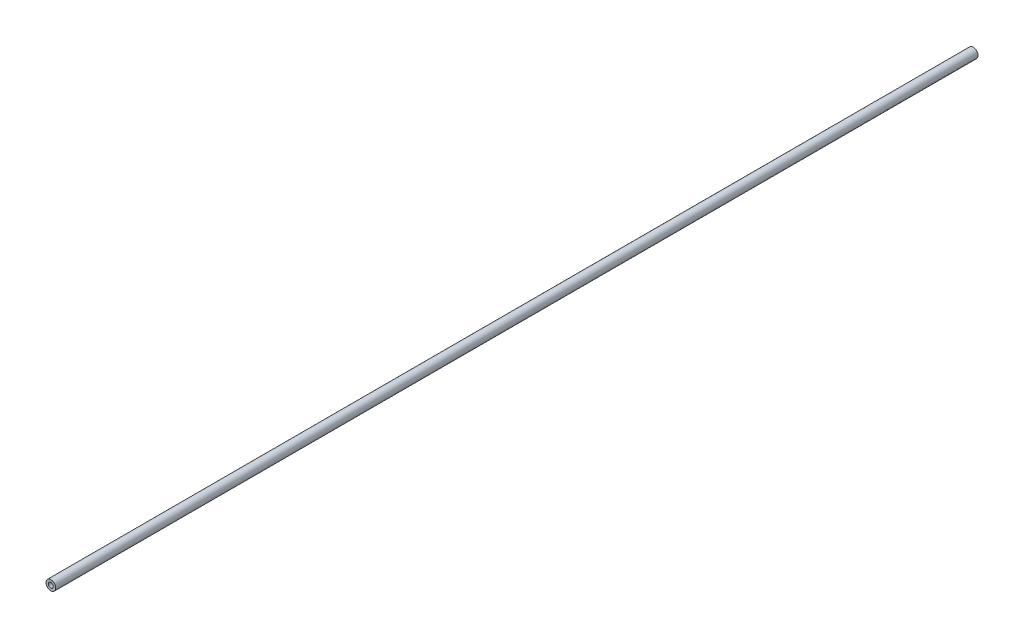
ISO-10303-21;
HEADER;
FILE_DESCRIPTION(('STEP AP214'),'2;1');
FILE_NAME('part.step','',(''),(''),'','','');
FILE_SCHEMA(('AUTOMOTIVE_DESIGN { 1 0 10303 214 1 1 1 1 }'));
ENDSEC;
DATA;
#1=APPLICATION_CONTEXT('core data for automotive mechanical design processes');
#2=APPLICATION_PROTOCOL_DEFINITION('international standard','automotive_design',2000,#1);
#3=PRODUCT_CONTEXT('',#1,'mechanical');
#4=PRODUCT('Part','Part','',(#3));
#5=PRODUCT_RELATED_PRODUCT_CATEGORY('part','',(#4));
#6=PRODUCT_DEFINITION_FORMATION('','',#4);
#7=PRODUCT_DEFINITION_CONTEXT('part definition',#1,'design');
#8=PRODUCT_DEFINITION('design','',#6,#7);
#9=PRODUCT_DEFINITION_SHAPE('','',#8);
#10=(LENGTH_UNIT() NAMED_UNIT(*) SI_UNIT(.MILLI.,.METRE.));
#11=(NAMED_UNIT(*) PLANE_ANGLE_UNIT() SI_UNIT($,.RADIAN.));
#12=(NAMED_UNIT(*) SI_UNIT($,.STERADIAN.) SOLID_ANGLE_UNIT());
#13=UNCERTAINTY_MEASURE_WITH_UNIT(LENGTH_MEASURE(1.E-05),#10,'distance_accuracy_value','');
#14=(GEOMETRIC_REPRESENTATION_CONTEXT(3) GLOBAL_UNCERTAINTY_ASSIGNED_CONTEXT((#13)) GLOBAL_UNIT_ASSIGNED_CONTEXT((#10,
#11,#12)) REPRESENTATION_CONTEXT('',''));
#15=CARTESIAN_POINT('',(0.,0.,0.));
#16=DIRECTION('',(0.,0.,1.));
#17=DIRECTION('',(1.,0.,0.));
#18=AXIS2_PLACEMENT_3D('',#15,#16,#17);
#19=CARTESIAN_POINT('',(0.,0.,380.));
#20=DIRECTION('',(0.,0.,1.));
#21=DIRECTION('',(1.,0.,0.));
#22=AXIS2_PLACEMENT_3D('',#19,#20,#21);
#23=PLANE('',#22);
#24=CARTESIAN_POINT('',(0.,0.,380.));
#25=DIRECTION('',(0.,0.,1.));
#26=DIRECTION('',(1.,0.,0.));
#27=AXIS2_PLACEMENT_3D('',#24,#25,#26);
#28=CIRCLE('',#27,2.);
#29=CARTESIAN_POINT('',(2.,0.,380.));
#30=VERTEX_POINT('',#29);
#31=EDGE_CURVE('E10',#30,#30,#28,.T.);
#32=ORIENTED_EDGE('',*,*,#31,.T.);
#33=EDGE_LOOP('',(#32));
#34=FACE_BOUND('',#33,.T.);
#35=CARTESIAN_POINT('',(0.,0.,380.));
#36=DIRECTION('',(0.,0.,1.));
#37=DIRECTION('',(1.,0.,0.));
#38=AXIS2_PLACEMENT_3D('',#35,#36,#37);
#39=CIRCLE('',#38,1.);
#40=CARTESIAN_POINT('',(1.,0.,380.));
#41=VERTEX_POINT('',#40);
#42=EDGE_CURVE('E43',#41,#41,#39,.T.);
#43=ORIENTED_EDGE('',*,*,#42,.F.);
#44=EDGE_LOOP('',(#43));
#45=FACE_BOUND('',#44,.T.);
#46=ADVANCED_FACE('F32',(#34,#45),#23,.T.);
#47=CARTESIAN_POINT('',(0.,0.,0.));
#48=DIRECTION('',(0.,0.,1.));
#49=DIRECTION('',(1.,0.,0.));
#50=AXIS2_PLACEMENT_3D('',#47,#48,#49);
#51=PLANE('',#50);
#52=CARTESIAN_POINT('',(0.,0.,0.));
#53=DIRECTION('',(0.,0.,1.));
#54=DIRECTION('',(1.,0.,0.));
#55=AXIS2_PLACEMENT_3D('',#52,#53,#54);
#56=CIRCLE('',#55,2.);
#57=CARTESIAN_POINT('',(2.,0.,0.));
#58=VERTEX_POINT('',#57);
#59=EDGE_CURVE('E36',#58,#58,#56,.T.);
#60=ORIENTED_EDGE('',*,*,#59,.F.);
#61=EDGE_LOOP('',(#60));
#62=FACE_BOUND('',#61,.T.);
#63=CARTESIAN_POINT('',(0.,0.,0.));
#64=DIRECTION('',(0.,0.,1.));
#65=DIRECTION('',(1.,0.,0.));
#66=AXIS2_PLACEMENT_3D('',#63,#64,#65);
#67=CIRCLE('',#66,1.);
#68=CARTESIAN_POINT('',(1.,0.,0.));
#69=VERTEX_POINT('',#68);
#70=EDGE_CURVE('E45',#69,#69,#67,.T.);
#71=ORIENTED_EDGE('',*,*,#70,.T.);
#72=EDGE_LOOP('',(#71));
#73=FACE_BOUND('',#72,.T.);
#74=ADVANCED_FACE('F55',(#62,#73),#51,.F.);
#75=CARTESIAN_POINT('',(0.,0.,380.));
#76=DIRECTION('',(0.,0.,-1.));
#77=DIRECTION('',(-1.,0.,0.));
#78=AXIS2_PLACEMENT_3D('',#75,#76,#77);
#79=CYLINDRICAL_SURFACE('',#78,2.);
#80=ORIENTED_EDGE('',*,*,#31,.F.);
#81=EDGE_LOOP('',(#80));
#82=FACE_BOUND('',#81,.T.);
#83=ORIENTED_EDGE('',*,*,#59,.T.);
#84=EDGE_LOOP('',(#83));
#85=FACE_BOUND('',#84,.T.);
#86=ADVANCED_FACE('F34',(#82,#85),#79,.T.);
#87=CARTESIAN_POINT('',(0.,0.,380.));
#88=DIRECTION('',(0.,0.,-1.));
#89=DIRECTION('',(-1.,0.,0.));
#90=AXIS2_PLACEMENT_3D('',#87,#88,#89);
#91=CYLINDRICAL_SURFACE('',#90,1.);
#92=ORIENTED_EDGE('',*,*,#42,.T.);
#93=EDGE_LOOP('',(#92));
#94=FACE_BOUND('',#93,.T.);
#95=ORIENTED_EDGE('',*,*,#70,.F.);
#96=EDGE_LOOP('',(#95));
#97=FACE_BOUND('',#96,.T.);
#98=ADVANCED_FACE('F51',(#94,#97),#91,.F.);
#99=CLOSED_SHELL('',(#46,#74,#86,#98));
#100=MANIFOLD_SOLID_BREP('B2',#99);
#101=ADVANCED_BREP_SHAPE_REPRESENTATION('',(#18,#100),#14);
#102=SHAPE_DEFINITION_REPRESENTATION(#9,#101);
ENDSEC;
END-ISO-10303-21;
